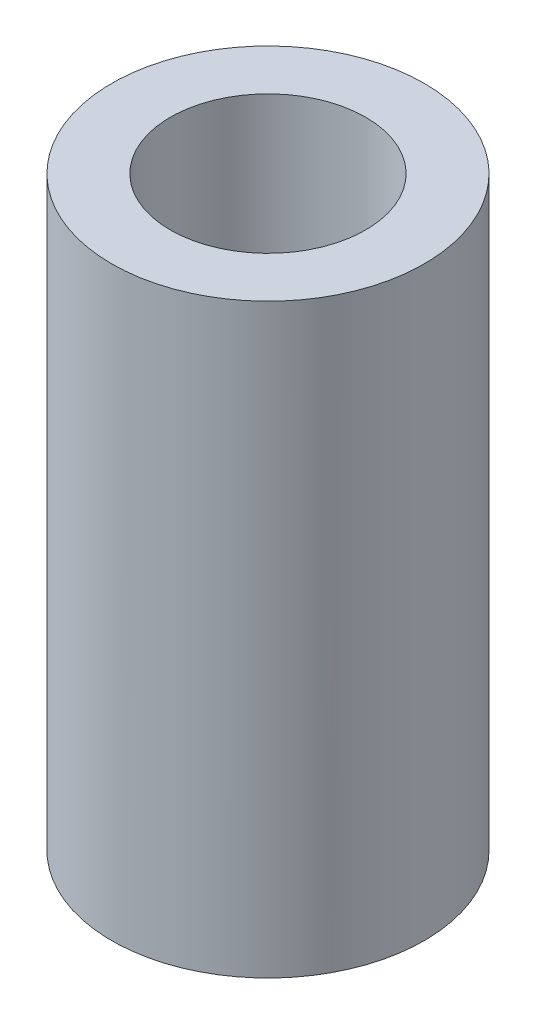
ISO-10303-21;
HEADER;
FILE_DESCRIPTION(('STEP AP214'),'2;1');
FILE_NAME('part.step','',(''),(''),'','','');
FILE_SCHEMA(('AUTOMOTIVE_DESIGN { 1 0 10303 214 1 1 1 1 }'));
ENDSEC;
DATA;
#1=APPLICATION_CONTEXT('core data for automotive mechanical design processes');
#2=APPLICATION_PROTOCOL_DEFINITION('international standard','automotive_design',2000,#1);
#3=PRODUCT_CONTEXT('',#1,'mechanical');
#4=PRODUCT('Part','Part','',(#3));
#5=PRODUCT_RELATED_PRODUCT_CATEGORY('part','',(#4));
#6=PRODUCT_DEFINITION_FORMATION('','',#4);
#7=PRODUCT_DEFINITION_CONTEXT('part definition',#1,'design');
#8=PRODUCT_DEFINITION('design','',#6,#7);
#9=PRODUCT_DEFINITION_SHAPE('','',#8);
#10=(LENGTH_UNIT() NAMED_UNIT(*) SI_UNIT(.MILLI.,.METRE.));
#11=(NAMED_UNIT(*) PLANE_ANGLE_UNIT() SI_UNIT($,.RADIAN.));
#12=(NAMED_UNIT(*) SI_UNIT($,.STERADIAN.) SOLID_ANGLE_UNIT());
#13=UNCERTAINTY_MEASURE_WITH_UNIT(LENGTH_MEASURE(1.E-05),#10,'distance_accuracy_value','');
#14=(GEOMETRIC_REPRESENTATION_CONTEXT(3) GLOBAL_UNCERTAINTY_ASSIGNED_CONTEXT((#13)) GLOBAL_UNIT_ASSIGNED_CONTEXT((#10,
#11,#12)) REPRESENTATION_CONTEXT('',''));
#15=CARTESIAN_POINT('',(0.,0.,0.));
#16=DIRECTION('',(0.,0.,1.));
#17=DIRECTION('',(1.,0.,0.));
#18=AXIS2_PLACEMENT_3D('',#15,#16,#17);
#19=CARTESIAN_POINT('',(0.,30.,0.));
#20=DIRECTION('',(0.,1.,0.));
#21=DIRECTION('',(0.,0.,1.));
#22=AXIS2_PLACEMENT_3D('',#19,#20,#21);
#23=PLANE('',#22);
#24=CARTESIAN_POINT('',(0.,30.,0.));
#25=DIRECTION('',(0.,1.,0.));
#26=DIRECTION('',(0.,0.,1.));
#27=AXIS2_PLACEMENT_3D('',#24,#25,#26);
#28=CIRCLE('',#27,16.);
#29=CARTESIAN_POINT('',(0.,30.,16.));
#30=VERTEX_POINT('',#29);
#31=EDGE_CURVE('E112',#30,#30,#28,.T.);
#32=ORIENTED_EDGE('',*,*,#31,.T.);
#33=EDGE_LOOP('',(#32));
#34=FACE_BOUND('',#33,.T.);
#35=CARTESIAN_POINT('',(0.,30.,0.));
#36=DIRECTION('',(0.,1.,0.));
#37=DIRECTION('',(0.,0.,1.));
#38=AXIS2_PLACEMENT_3D('',#35,#36,#37);
#39=CIRCLE('',#38,10.);
#40=CARTESIAN_POINT('',(0.,30.,10.));
#41=VERTEX_POINT('',#40);
#42=EDGE_CURVE('E109',#41,#41,#39,.T.);
#43=ORIENTED_EDGE('',*,*,#42,.F.);
#44=EDGE_LOOP('',(#43));
#45=FACE_BOUND('',#44,.T.);
#46=ADVANCED_FACE('F33',(#34,#45),#23,.T.);
#47=CARTESIAN_POINT('',(0.,30.,0.));
#48=DIRECTION('',(0.,-1.,0.));
#49=DIRECTION('',(0.,0.,-1.));
#50=AXIS2_PLACEMENT_3D('',#47,#48,#49);
#51=CYLINDRICAL_SURFACE('',#50,16.);
#52=ORIENTED_EDGE('',*,*,#31,.F.);
#53=EDGE_LOOP('',(#52));
#54=FACE_BOUND('',#53,.T.);
#55=CARTESIAN_POINT('',(0.,-30.,0.));
#56=DIRECTION('',(0.,-1.,0.));
#57=DIRECTION('',(0.,0.,-1.));
#58=AXIS2_PLACEMENT_3D('',#55,#56,#57);
#59=CIRCLE('',#58,16.);
#60=CARTESIAN_POINT('',(0.,-30.,-16.));
#61=VERTEX_POINT('',#60);
#62=EDGE_CURVE('E103',#61,#61,#59,.T.);
#63=ORIENTED_EDGE('',*,*,#62,.F.);
#64=EDGE_LOOP('',(#63));
#65=FACE_BOUND('',#64,.T.);
#66=ADVANCED_FACE('F35',(#54,#65),#51,.T.);
#67=CARTESIAN_POINT('',(0.,30.,0.));
#68=DIRECTION('',(0.,-1.,0.));
#69=DIRECTION('',(0.,0.,-1.));
#70=AXIS2_PLACEMENT_3D('',#67,#68,#69);
#71=CYLINDRICAL_SURFACE('',#70,10.);
#72=ORIENTED_EDGE('',*,*,#42,.T.);
#73=EDGE_LOOP('',(#72));
#74=FACE_BOUND('',#73,.T.);
#75=CARTESIAN_POINT('',(0.,0.,0.));
#76=DIRECTION('',(0.,1.,0.));
#77=DIRECTION('',(0.,0.,1.));
#78=AXIS2_PLACEMENT_3D('',#75,#76,#77);
#79=CIRCLE('',#78,10.);
#80=CARTESIAN_POINT('',(0.,0.,10.));
#81=VERTEX_POINT('',#80);
#82=EDGE_CURVE('E108',#81,#81,#79,.T.);
#83=ORIENTED_EDGE('',*,*,#82,.F.);
#84=EDGE_LOOP('',(#83));
#85=FACE_BOUND('',#84,.T.);
#86=ADVANCED_FACE('F137',(#74,#85),#71,.F.);
#87=CARTESIAN_POINT('',(0.,0.,0.));
#88=DIRECTION('',(0.,-1.,0.));
#89=DIRECTION('',(0.,0.,-1.));
#90=AXIS2_PLACEMENT_3D('',#87,#88,#89);
#91=PLANE('',#90);
#92=DIRECTION('',(1.,0.,0.));
#93=VECTOR('',#92,1.);
#94=CARTESIAN_POINT('',(-1.5,0.,-7.75));
#95=LINE('',#94,#93);
#96=CARTESIAN_POINT('',(-1.5,0.,-7.75));
#97=VERTEX_POINT('',#96);
#98=CARTESIAN_POINT('',(1.5,0.,-7.75));
#99=VERTEX_POINT('',#98);
#100=EDGE_CURVE('E80',#97,#99,#95,.T.);
#101=ORIENTED_EDGE('',*,*,#100,.T.);
#102=DIRECTION('',(0.,0.,1.));
#103=VECTOR('',#102,1.);
#104=CARTESIAN_POINT('',(1.5,0.,-5.25));
#105=LINE('',#104,#103);
#106=CARTESIAN_POINT('',(1.5,0.,-6.32455532033676));
#107=VERTEX_POINT('',#106);
#108=EDGE_CURVE('E91',#99,#107,#105,.T.);
#109=ORIENTED_EDGE('',*,*,#108,.T.);
#110=CARTESIAN_POINT('',(0.,0.,0.));
#111=DIRECTION('',(0.,-1.,0.));
#112=DIRECTION('',(0.,0.,-1.));
#113=AXIS2_PLACEMENT_3D('',#110,#111,#112);
#114=CIRCLE('',#113,6.5);
#115=CARTESIAN_POINT('',(-1.5,0.,-6.32455532033676));
#116=VERTEX_POINT('',#115);
#117=EDGE_CURVE('E90',#107,#116,#114,.T.);
#118=ORIENTED_EDGE('',*,*,#117,.T.);
#119=DIRECTION('',(0.,0.,-1.));
#120=VECTOR('',#119,1.);
#121=CARTESIAN_POINT('',(-1.5,0.,-5.25));
#122=LINE('',#121,#120);
#123=EDGE_CURVE('E48',#116,#97,#122,.T.);
#124=ORIENTED_EDGE('',*,*,#123,.T.);
#125=EDGE_LOOP('',(#101,#109,#118,#124));
#126=FACE_BOUND('',#125,.T.);
#127=ORIENTED_EDGE('',*,*,#82,.T.);
#128=EDGE_LOOP('',(#127));
#129=FACE_BOUND('',#128,.T.);
#130=ADVANCED_FACE('F87',(#126,#129),#91,.F.);
#131=CARTESIAN_POINT('',(0.,-30.,0.));
#132=DIRECTION('',(0.,-1.,0.));
#133=DIRECTION('',(0.,0.,-1.));
#134=AXIS2_PLACEMENT_3D('',#131,#132,#133);
#135=PLANE('',#134);
#136=DIRECTION('',(0.,0.,1.));
#137=VECTOR('',#136,1.);
#138=CARTESIAN_POINT('',(1.5,-30.,-5.25));
#139=LINE('',#138,#137);
#140=CARTESIAN_POINT('',(1.5,-30.,-7.75));
#141=VERTEX_POINT('',#140);
#142=CARTESIAN_POINT('',(1.5,-30.,-6.32455532033676));
#143=VERTEX_POINT('',#142);
#144=EDGE_CURVE('E96',#141,#143,#139,.T.);
#145=ORIENTED_EDGE('',*,*,#144,.F.);
#146=DIRECTION('',(1.,0.,0.));
#147=VECTOR('',#146,1.);
#148=CARTESIAN_POINT('',(-1.5,-30.,-7.75));
#149=LINE('',#148,#147);
#150=CARTESIAN_POINT('',(-1.5,-30.,-7.75));
#151=VERTEX_POINT('',#150);
#152=EDGE_CURVE('E93',#151,#141,#149,.T.);
#153=ORIENTED_EDGE('',*,*,#152,.F.);
#154=DIRECTION('',(0.,0.,-1.));
#155=VECTOR('',#154,1.);
#156=CARTESIAN_POINT('',(-1.5,-30.,-5.25));
#157=LINE('',#156,#155);
#158=CARTESIAN_POINT('',(-1.5,-30.,-6.32455532033676));
#159=VERTEX_POINT('',#158);
#160=EDGE_CURVE('E75',#159,#151,#157,.T.);
#161=ORIENTED_EDGE('',*,*,#160,.F.);
#162=CARTESIAN_POINT('',(0.,-30.,0.));
#163=DIRECTION('',(0.,-1.,0.));
#164=DIRECTION('',(0.,0.,-1.));
#165=AXIS2_PLACEMENT_3D('',#162,#163,#164);
#166=CIRCLE('',#165,6.5);
#167=EDGE_CURVE('E100',#143,#159,#166,.T.);
#168=ORIENTED_EDGE('',*,*,#167,.F.);
#169=EDGE_LOOP('',(#145,#153,#161,#168));
#170=FACE_BOUND('',#169,.T.);
#171=ORIENTED_EDGE('',*,*,#62,.T.);
#172=EDGE_LOOP('',(#171));
#173=FACE_BOUND('',#172,.T.);
#174=ADVANCED_FACE('F121',(#170,#173),#135,.T.);
#175=CARTESIAN_POINT('',(0.,0.,0.));
#176=DIRECTION('',(0.,-1.,0.));
#177=DIRECTION('',(0.,0.,-1.));
#178=AXIS2_PLACEMENT_3D('',#175,#176,#177);
#179=CYLINDRICAL_SURFACE('',#178,6.5);
#180=ORIENTED_EDGE('',*,*,#117,.F.);
#181=DIRECTION('',(0.,-1.,0.));
#182=VECTOR('',#181,1.);
#183=CARTESIAN_POINT('',(1.5,0.,-6.32455532033676));
#184=LINE('',#183,#182);
#185=EDGE_CURVE('E11',#107,#143,#184,.T.);
#186=ORIENTED_EDGE('',*,*,#185,.T.);
#187=ORIENTED_EDGE('',*,*,#167,.T.);
#188=DIRECTION('',(0.,-1.,0.));
#189=VECTOR('',#188,1.);
#190=CARTESIAN_POINT('',(-1.5,0.,-6.32455532033676));
#191=LINE('',#190,#189);
#192=EDGE_CURVE('E41',#159,#116,#191,.F.);
#193=ORIENTED_EDGE('',*,*,#192,.T.);
#194=EDGE_LOOP('',(#180,#186,#187,#193));
#195=FACE_BOUND('',#194,.T.);
#196=ADVANCED_FACE('F117',(#195),#179,.F.);
#197=CARTESIAN_POINT('',(1.5,0.,-5.25));
#198=DIRECTION('',(1.,0.,0.));
#199=DIRECTION('',(0.,0.,-1.));
#200=AXIS2_PLACEMENT_3D('',#197,#198,#199);
#201=PLANE('',#200);
#202=ORIENTED_EDGE('',*,*,#108,.F.);
#203=DIRECTION('',(0.,-1.,0.));
#204=VECTOR('',#203,1.);
#205=CARTESIAN_POINT('',(1.5,0.,-7.75));
#206=LINE('',#205,#204);
#207=EDGE_CURVE('E79',#99,#141,#206,.T.);
#208=ORIENTED_EDGE('',*,*,#207,.T.);
#209=ORIENTED_EDGE('',*,*,#144,.T.);
#210=ORIENTED_EDGE('',*,*,#185,.F.);
#211=EDGE_LOOP('',(#202,#208,#209,#210));
#212=FACE_BOUND('',#211,.T.);
#213=ADVANCED_FACE('F123',(#212),#201,.F.);
#214=CARTESIAN_POINT('',(-1.5,0.,-5.25));
#215=DIRECTION('',(-1.,0.,0.));
#216=DIRECTION('',(0.,0.,1.));
#217=AXIS2_PLACEMENT_3D('',#214,#215,#216);
#218=PLANE('',#217);
#219=ORIENTED_EDGE('',*,*,#160,.T.);
#220=DIRECTION('',(0.,-1.,0.));
#221=VECTOR('',#220,1.);
#222=CARTESIAN_POINT('',(-1.5,0.,-7.75));
#223=LINE('',#222,#221);
#224=EDGE_CURVE('E71',#97,#151,#223,.T.);
#225=ORIENTED_EDGE('',*,*,#224,.F.);
#226=ORIENTED_EDGE('',*,*,#123,.F.);
#227=ORIENTED_EDGE('',*,*,#192,.F.);
#228=EDGE_LOOP('',(#219,#225,#226,#227));
#229=FACE_BOUND('',#228,.T.);
#230=ADVANCED_FACE('F73',(#229),#218,.F.);
#231=CARTESIAN_POINT('',(-1.5,0.,-7.75));
#232=DIRECTION('',(0.,0.,-1.));
#233=DIRECTION('',(-1.,0.,0.));
#234=AXIS2_PLACEMENT_3D('',#231,#232,#233);
#235=PLANE('',#234);
#236=ORIENTED_EDGE('',*,*,#152,.T.);
#237=ORIENTED_EDGE('',*,*,#207,.F.);
#238=ORIENTED_EDGE('',*,*,#100,.F.);
#239=ORIENTED_EDGE('',*,*,#224,.T.);
#240=EDGE_LOOP('',(#236,#237,#238,#239));
#241=FACE_BOUND('',#240,.T.);
#242=ADVANCED_FACE('F83',(#241),#235,.F.);
#243=CLOSED_SHELL('',(#46,#66,#86,#130,#174,#196,#213,#230,#242));
#244=MANIFOLD_SOLID_BREP('B2',#243);
#245=ADVANCED_BREP_SHAPE_REPRESENTATION('',(#18,#244),#14);
#246=SHAPE_DEFINITION_REPRESENTATION(#9,#245);
ENDSEC;
END-ISO-10303-21;
